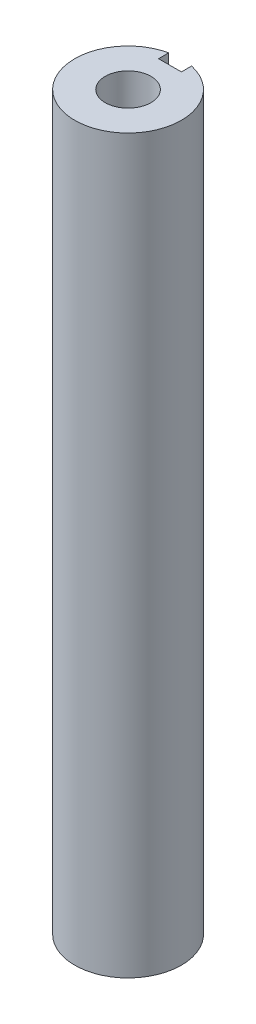
ISO-10303-21;
HEADER;
FILE_DESCRIPTION(('STEP AP214'),'2;1');
FILE_NAME('part.step','',(''),(''),'','','');
FILE_SCHEMA(('AUTOMOTIVE_DESIGN { 1 0 10303 214 1 1 1 1 }'));
ENDSEC;
DATA;
#1=APPLICATION_CONTEXT('core data for automotive mechanical design processes');
#2=APPLICATION_PROTOCOL_DEFINITION('international standard','automotive_design',2000,#1);
#3=PRODUCT_CONTEXT('',#1,'mechanical');
#4=PRODUCT('Part','Part','',(#3));
#5=PRODUCT_RELATED_PRODUCT_CATEGORY('part','',(#4));
#6=PRODUCT_DEFINITION_FORMATION('','',#4);
#7=PRODUCT_DEFINITION_CONTEXT('part definition',#1,'design');
#8=PRODUCT_DEFINITION('design','',#6,#7);
#9=PRODUCT_DEFINITION_SHAPE('','',#8);
#10=(LENGTH_UNIT() NAMED_UNIT(*) SI_UNIT(.MILLI.,.METRE.));
#11=(NAMED_UNIT(*) PLANE_ANGLE_UNIT() SI_UNIT($,.RADIAN.));
#12=(NAMED_UNIT(*) SI_UNIT($,.STERADIAN.) SOLID_ANGLE_UNIT());
#13=UNCERTAINTY_MEASURE_WITH_UNIT(LENGTH_MEASURE(1.E-05),#10,'distance_accuracy_value','');
#14=(GEOMETRIC_REPRESENTATION_CONTEXT(3) GLOBAL_UNCERTAINTY_ASSIGNED_CONTEXT((#13)) GLOBAL_UNIT_ASSIGNED_CONTEXT((#10,
#11,#12)) REPRESENTATION_CONTEXT('',''));
#15=CARTESIAN_POINT('',(0.,0.,0.));
#16=DIRECTION('',(0.,0.,1.));
#17=DIRECTION('',(1.,0.,0.));
#18=AXIS2_PLACEMENT_3D('',#15,#16,#17);
#19=CARTESIAN_POINT('',(0.,152.4,0.));
#20=DIRECTION('',(0.,-1.,0.));
#21=DIRECTION('',(0.,0.,-1.));
#22=AXIS2_PLACEMENT_3D('',#19,#20,#21);
#23=PLANE('',#22);
#24=CARTESIAN_POINT('',(0.,152.4,0.));
#25=DIRECTION('',(0.,1.,0.));
#26=DIRECTION('',(0.,0.,-1.));
#27=AXIS2_PLACEMENT_3D('',#24,#25,#26);
#28=CIRCLE('',#27,11.1125);
#29=CARTESIAN_POINT('',(-2.38125,152.4,-10.854368000372));
#30=VERTEX_POINT('',#29);
#31=CARTESIAN_POINT('',(2.38125,152.4,-10.854368000372));
#32=VERTEX_POINT('',#31);
#33=EDGE_CURVE('E97',#30,#32,#28,.T.);
#34=ORIENTED_EDGE('',*,*,#33,.T.);
#35=DIRECTION('',(0.,0.,1.));
#36=VECTOR('',#35,1.);
#37=CARTESIAN_POINT('',(2.38125,152.4,-10.854368000372));
#38=LINE('',#37,#36);
#39=CARTESIAN_POINT('',(2.38125,152.4,-8.73125));
#40=VERTEX_POINT('',#39);
#41=EDGE_CURVE('E92',#32,#40,#38,.T.);
#42=ORIENTED_EDGE('',*,*,#41,.T.);
#43=DIRECTION('',(-1.,0.,0.));
#44=VECTOR('',#43,1.);
#45=CARTESIAN_POINT('',(-2.38125,152.4,-8.73125));
#46=LINE('',#45,#44);
#47=CARTESIAN_POINT('',(-2.38125,152.4,-8.73125));
#48=VERTEX_POINT('',#47);
#49=EDGE_CURVE('E95',#40,#48,#46,.T.);
#50=ORIENTED_EDGE('',*,*,#49,.T.);
#51=DIRECTION('',(0.,0.,-1.));
#52=VECTOR('',#51,1.);
#53=CARTESIAN_POINT('',(-2.38125,152.4,-10.854368000372));
#54=LINE('',#53,#52);
#55=EDGE_CURVE('E62',#48,#30,#54,.T.);
#56=ORIENTED_EDGE('',*,*,#55,.T.);
#57=EDGE_LOOP('',(#34,#42,#50,#56));
#58=FACE_BOUND('',#57,.T.);
#59=CARTESIAN_POINT('',(0.,152.4,0.));
#60=DIRECTION('',(0.,1.,0.));
#61=DIRECTION('',(0.,0.,1.));
#62=AXIS2_PLACEMENT_3D('',#59,#60,#61);
#63=CIRCLE('',#62,4.7625);
#64=CARTESIAN_POINT('',(0.,152.4,-4.7625));
#65=VERTEX_POINT('',#64);
#66=EDGE_CURVE('E112',#65,#65,#63,.T.);
#67=ORIENTED_EDGE('',*,*,#66,.F.);
#68=EDGE_LOOP('',(#67));
#69=FACE_BOUND('',#68,.T.);
#70=ADVANCED_FACE('F45',(#58,#69),#23,.F.);
#71=CARTESIAN_POINT('',(0.,0.,0.));
#72=DIRECTION('',(0.,-1.,0.));
#73=DIRECTION('',(0.,0.,-1.));
#74=AXIS2_PLACEMENT_3D('',#71,#72,#73);
#75=PLANE('',#74);
#76=CARTESIAN_POINT('',(0.,0.,0.));
#77=DIRECTION('',(0.,1.,0.));
#78=DIRECTION('',(0.,0.,-1.));
#79=AXIS2_PLACEMENT_3D('',#76,#77,#78);
#80=CIRCLE('',#79,11.1125);
#81=CARTESIAN_POINT('',(-2.38125,0.,-10.854368000372));
#82=VERTEX_POINT('',#81);
#83=CARTESIAN_POINT('',(2.38125,0.,-10.854368000372));
#84=VERTEX_POINT('',#83);
#85=EDGE_CURVE('E109',#82,#84,#80,.T.);
#86=ORIENTED_EDGE('',*,*,#85,.F.);
#87=DIRECTION('',(0.,0.,-1.));
#88=VECTOR('',#87,1.);
#89=CARTESIAN_POINT('',(-2.38125,0.,-10.854368000372));
#90=LINE('',#89,#88);
#91=CARTESIAN_POINT('',(-2.38125,0.,-8.73125));
#92=VERTEX_POINT('',#91);
#93=EDGE_CURVE('E85',#92,#82,#90,.T.);
#94=ORIENTED_EDGE('',*,*,#93,.F.);
#95=DIRECTION('',(-1.,0.,0.));
#96=VECTOR('',#95,1.);
#97=CARTESIAN_POINT('',(-2.38125,0.,-8.73125));
#98=LINE('',#97,#96);
#99=CARTESIAN_POINT('',(2.38125,0.,-8.73125));
#100=VERTEX_POINT('',#99);
#101=EDGE_CURVE('E79',#100,#92,#98,.T.);
#102=ORIENTED_EDGE('',*,*,#101,.F.);
#103=DIRECTION('',(0.,0.,1.));
#104=VECTOR('',#103,1.);
#105=CARTESIAN_POINT('',(2.38125,0.,-10.854368000372));
#106=LINE('',#105,#104);
#107=EDGE_CURVE('E101',#84,#100,#106,.T.);
#108=ORIENTED_EDGE('',*,*,#107,.F.);
#109=EDGE_LOOP('',(#86,#94,#102,#108));
#110=FACE_BOUND('',#109,.T.);
#111=CARTESIAN_POINT('',(0.,0.,0.));
#112=DIRECTION('',(0.,1.,0.));
#113=DIRECTION('',(0.,0.,1.));
#114=AXIS2_PLACEMENT_3D('',#111,#112,#113);
#115=CIRCLE('',#114,4.7625);
#116=CARTESIAN_POINT('',(0.,0.,-4.7625));
#117=VERTEX_POINT('',#116);
#118=EDGE_CURVE('E124',#117,#117,#115,.T.);
#119=ORIENTED_EDGE('',*,*,#118,.T.);
#120=EDGE_LOOP('',(#119));
#121=FACE_BOUND('',#120,.T.);
#122=ADVANCED_FACE('F120',(#110,#121),#75,.T.);
#123=CARTESIAN_POINT('',(0.,152.4,0.));
#124=DIRECTION('',(0.,-1.,0.));
#125=DIRECTION('',(0.,0.,-1.));
#126=AXIS2_PLACEMENT_3D('',#123,#124,#125);
#127=CYLINDRICAL_SURFACE('',#126,11.1125);
#128=ORIENTED_EDGE('',*,*,#85,.T.);
#129=DIRECTION('',(0.,-1.,0.));
#130=VECTOR('',#129,1.);
#131=CARTESIAN_POINT('',(2.38125,152.4,-10.854368000372));
#132=LINE('',#131,#130);
#133=EDGE_CURVE('E11',#32,#84,#132,.T.);
#134=ORIENTED_EDGE('',*,*,#133,.F.);
#135=ORIENTED_EDGE('',*,*,#33,.F.);
#136=DIRECTION('',(0.,-1.,0.));
#137=VECTOR('',#136,1.);
#138=CARTESIAN_POINT('',(-2.38125,152.4,-10.854368000372));
#139=LINE('',#138,#137);
#140=EDGE_CURVE('E105',#30,#82,#139,.T.);
#141=ORIENTED_EDGE('',*,*,#140,.T.);
#142=EDGE_LOOP('',(#128,#134,#135,#141));
#143=FACE_BOUND('',#142,.T.);
#144=ADVANCED_FACE('F47',(#143),#127,.T.);
#145=CARTESIAN_POINT('',(2.38125,152.4,-10.854368000372));
#146=DIRECTION('',(1.,0.,0.));
#147=DIRECTION('',(0.,0.,-1.));
#148=AXIS2_PLACEMENT_3D('',#145,#146,#147);
#149=PLANE('',#148);
#150=ORIENTED_EDGE('',*,*,#107,.T.);
#151=DIRECTION('',(0.,-1.,0.));
#152=VECTOR('',#151,1.);
#153=CARTESIAN_POINT('',(2.38125,152.4,-8.73125));
#154=LINE('',#153,#152);
#155=EDGE_CURVE('E54',#40,#100,#154,.T.);
#156=ORIENTED_EDGE('',*,*,#155,.F.);
#157=ORIENTED_EDGE('',*,*,#41,.F.);
#158=ORIENTED_EDGE('',*,*,#133,.T.);
#159=EDGE_LOOP('',(#150,#156,#157,#158));
#160=FACE_BOUND('',#159,.T.);
#161=ADVANCED_FACE('F100',(#160),#149,.F.);
#162=CARTESIAN_POINT('',(-2.38125,152.4,-8.73125));
#163=DIRECTION('',(0.,0.,1.));
#164=DIRECTION('',(1.,0.,0.));
#165=AXIS2_PLACEMENT_3D('',#162,#163,#164);
#166=PLANE('',#165);
#167=ORIENTED_EDGE('',*,*,#101,.T.);
#168=DIRECTION('',(0.,-1.,0.));
#169=VECTOR('',#168,1.);
#170=CARTESIAN_POINT('',(-2.38125,152.4,-8.73125));
#171=LINE('',#170,#169);
#172=EDGE_CURVE('E102',#48,#92,#171,.T.);
#173=ORIENTED_EDGE('',*,*,#172,.F.);
#174=ORIENTED_EDGE('',*,*,#49,.F.);
#175=ORIENTED_EDGE('',*,*,#155,.T.);
#176=EDGE_LOOP('',(#167,#173,#174,#175));
#177=FACE_BOUND('',#176,.T.);
#178=ADVANCED_FACE('F103',(#177),#166,.F.);
#179=CARTESIAN_POINT('',(-2.38125,152.4,-10.854368000372));
#180=DIRECTION('',(-1.,0.,0.));
#181=DIRECTION('',(0.,0.,1.));
#182=AXIS2_PLACEMENT_3D('',#179,#180,#181);
#183=PLANE('',#182);
#184=ORIENTED_EDGE('',*,*,#93,.T.);
#185=ORIENTED_EDGE('',*,*,#140,.F.);
#186=ORIENTED_EDGE('',*,*,#55,.F.);
#187=ORIENTED_EDGE('',*,*,#172,.T.);
#188=EDGE_LOOP('',(#184,#185,#186,#187));
#189=FACE_BOUND('',#188,.T.);
#190=ADVANCED_FACE('F117',(#189),#183,.F.);
#191=CARTESIAN_POINT('',(0.,152.4,0.));
#192=DIRECTION('',(0.,-1.,0.));
#193=DIRECTION('',(0.,0.,-1.));
#194=AXIS2_PLACEMENT_3D('',#191,#192,#193);
#195=CYLINDRICAL_SURFACE('',#194,4.7625);
#196=CARTESIAN_POINT('',(0.,152.4,-4.7625));
#197=CARTESIAN_POINT('',(0.,150.8125,-4.7625));
#198=CARTESIAN_POINT('',(0.,149.225,-4.7625));
#199=CARTESIAN_POINT('',(0.,146.05,-4.7625));
#200=CARTESIAN_POINT('',(0.,144.4625,-4.7625));
#201=CARTESIAN_POINT('',(0.,141.2875,-4.7625));
#202=CARTESIAN_POINT('',(0.,139.7,-4.7625));
#203=CARTESIAN_POINT('',(0.,136.525,-4.7625));
#204=CARTESIAN_POINT('',(0.,134.9375,-4.7625));
#205=CARTESIAN_POINT('',(0.,131.7625,-4.7625));
#206=CARTESIAN_POINT('',(0.,130.175,-4.7625));
#207=CARTESIAN_POINT('',(0.,127.,-4.7625));
#208=CARTESIAN_POINT('',(0.,125.4125,-4.7625));
#209=CARTESIAN_POINT('',(0.,122.2375,-4.7625));
#210=CARTESIAN_POINT('',(0.,120.65,-4.7625));
#211=CARTESIAN_POINT('',(0.,117.475,-4.7625));
#212=CARTESIAN_POINT('',(0.,115.8875,-4.7625));
#213=CARTESIAN_POINT('',(0.,112.7125,-4.7625));
#214=CARTESIAN_POINT('',(0.,111.125,-4.7625));
#215=CARTESIAN_POINT('',(0.,107.95,-4.7625));
#216=CARTESIAN_POINT('',(0.,106.3625,-4.7625));
#217=CARTESIAN_POINT('',(0.,103.1875,-4.7625));
#218=CARTESIAN_POINT('',(0.,101.6,-4.7625));
#219=CARTESIAN_POINT('',(0.,98.425,-4.7625));
#220=CARTESIAN_POINT('',(0.,96.8375,-4.7625));
#221=CARTESIAN_POINT('',(0.,93.6625,-4.7625));
#222=CARTESIAN_POINT('',(0.,92.075,-4.7625));
#223=CARTESIAN_POINT('',(0.,88.9,-4.7625));
#224=CARTESIAN_POINT('',(0.,87.3125,-4.7625));
#225=CARTESIAN_POINT('',(0.,84.1375,-4.7625));
#226=CARTESIAN_POINT('',(0.,82.55,-4.7625));
#227=CARTESIAN_POINT('',(0.,79.375,-4.7625));
#228=CARTESIAN_POINT('',(0.,77.7875,-4.7625));
#229=CARTESIAN_POINT('',(0.,74.6125,-4.7625));
#230=CARTESIAN_POINT('',(0.,73.025,-4.7625));
#231=CARTESIAN_POINT('',(0.,69.85,-4.7625));
#232=CARTESIAN_POINT('',(0.,68.2625,-4.7625));
#233=CARTESIAN_POINT('',(0.,65.0875,-4.7625));
#234=CARTESIAN_POINT('',(0.,63.5,-4.7625));
#235=CARTESIAN_POINT('',(0.,60.325,-4.7625));
#236=CARTESIAN_POINT('',(0.,58.7375,-4.7625));
#237=CARTESIAN_POINT('',(0.,55.5625,-4.7625));
#238=CARTESIAN_POINT('',(0.,53.975,-4.7625));
#239=CARTESIAN_POINT('',(0.,50.8,-4.7625));
#240=CARTESIAN_POINT('',(0.,49.2125,-4.7625));
#241=CARTESIAN_POINT('',(0.,46.0375,-4.7625));
#242=CARTESIAN_POINT('',(0.,44.45,-4.7625));
#243=CARTESIAN_POINT('',(0.,41.275,-4.7625));
#244=CARTESIAN_POINT('',(0.,39.6875,-4.7625));
#245=CARTESIAN_POINT('',(0.,36.5125,-4.7625));
#246=CARTESIAN_POINT('',(0.,34.925,-4.7625));
#247=CARTESIAN_POINT('',(0.,31.75,-4.7625));
#248=CARTESIAN_POINT('',(0.,30.1625,-4.7625));
#249=CARTESIAN_POINT('',(0.,26.9875,-4.7625));
#250=CARTESIAN_POINT('',(0.,25.4,-4.7625));
#251=CARTESIAN_POINT('',(0.,22.225,-4.7625));
#252=CARTESIAN_POINT('',(0.,20.6375,-4.7625));
#253=CARTESIAN_POINT('',(0.,17.4625,-4.7625));
#254=CARTESIAN_POINT('',(0.,15.875,-4.7625));
#255=CARTESIAN_POINT('',(0.,12.7,-4.7625));
#256=CARTESIAN_POINT('',(0.,11.1125,-4.7625));
#257=CARTESIAN_POINT('',(0.,7.93750000000001,-4.7625));
#258=CARTESIAN_POINT('',(0.,6.35,-4.7625));
#259=CARTESIAN_POINT('',(0.,3.175,-4.7625));
#260=CARTESIAN_POINT('',(0.,1.5875,-4.7625));
#261=CARTESIAN_POINT('',(0.,0.,-4.7625));
#262=B_SPLINE_CURVE_WITH_KNOTS('',3,(#196,#197,#198,#199,#200,#201,#202,#203,#204,#205,#206,
#207,#208,#209,#210,#211,#212,#213,#214,#215,#216,#217,#218,#219,#220,#221,#222,#223,#224,#225,
#226,#227,#228,#229,#230,#231,#232,#233,#234,#235,#236,#237,#238,#239,#240,#241,#242,#243,#244,
#245,#246,#247,#248,#249,#250,#251,#252,#253,#254,#255,#256,#257,#258,#259,#260,#261),
.UNSPECIFIED.,.F.,.F.,(4,2,2,2,2,2,2,2,2,2,2,2,2,2,2,2,2,2,2,2,2,2,2,2,2,2,2,2,2,2,2,2,4),(0.,
4.76249999999998,9.52499999999998,14.2875,19.05,23.8125,28.575,33.3375,38.1,42.8625,47.625,
52.3875,57.15,61.9125,66.675,71.4375,76.2,80.9625,85.725,90.4875,95.25,100.0125,104.775,
109.5375,114.3,119.0625,123.825,128.5875,133.35,138.1125,142.875,147.6375,152.4),.UNSPECIFIED.);
#263=EDGE_CURVE('BSEAM130',#65,#117,#262,.T.);
#264=ORIENTED_EDGE('',*,*,#66,.T.);
#265=ORIENTED_EDGE('',*,*,#118,.F.);
#266=ORIENTED_EDGE('',*,*,#263,.T.);
#267=ORIENTED_EDGE('',*,*,#263,.F.);
#268=EDGE_LOOP('',(#264,#266,#265,#267));
#269=FACE_BOUND('',#268,.T.);
#270=ADVANCED_FACE('F130',(#269),#195,.F.);
#271=CLOSED_SHELL('',(#70,#122,#144,#161,#178,#190,#270));
#272=MANIFOLD_SOLID_BREP('B2',#271);
#273=ADVANCED_BREP_SHAPE_REPRESENTATION('',(#18,#272),#14);
#274=SHAPE_DEFINITION_REPRESENTATION(#9,#273);
ENDSEC;
END-ISO-10303-21;
